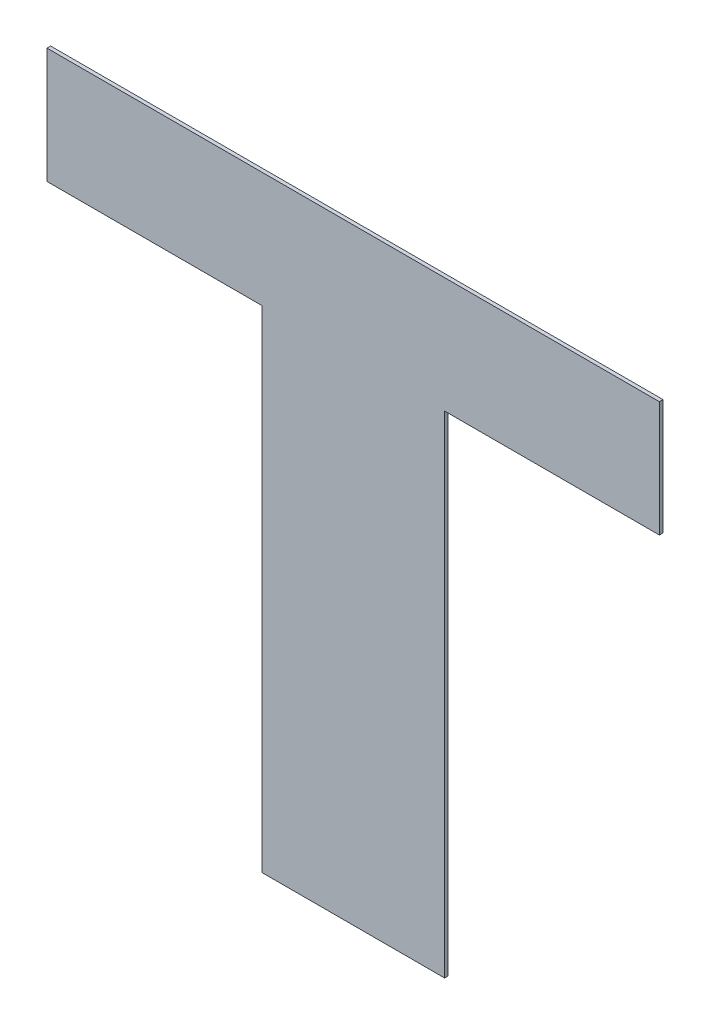
ISO-10303-21;
HEADER;
FILE_DESCRIPTION(('STEP AP214'),'2;1');
FILE_NAME('part.step','',(''),(''),'','','');
FILE_SCHEMA(('AUTOMOTIVE_DESIGN { 1 0 10303 214 1 1 1 1 }'));
ENDSEC;
DATA;
#1=APPLICATION_CONTEXT('core data for automotive mechanical design processes');
#2=APPLICATION_PROTOCOL_DEFINITION('international standard','automotive_design',2000,#1);
#3=PRODUCT_CONTEXT('',#1,'mechanical');
#4=PRODUCT('Part','Part','',(#3));
#5=PRODUCT_RELATED_PRODUCT_CATEGORY('part','',(#4));
#6=PRODUCT_DEFINITION_FORMATION('','',#4);
#7=PRODUCT_DEFINITION_CONTEXT('part definition',#1,'design');
#8=PRODUCT_DEFINITION('design','',#6,#7);
#9=PRODUCT_DEFINITION_SHAPE('','',#8);
#10=(LENGTH_UNIT() NAMED_UNIT(*) SI_UNIT(.MILLI.,.METRE.));
#11=(NAMED_UNIT(*) PLANE_ANGLE_UNIT() SI_UNIT($,.RADIAN.));
#12=(NAMED_UNIT(*) SI_UNIT($,.STERADIAN.) SOLID_ANGLE_UNIT());
#13=UNCERTAINTY_MEASURE_WITH_UNIT(LENGTH_MEASURE(1.E-05),#10,'distance_accuracy_value','');
#14=(GEOMETRIC_REPRESENTATION_CONTEXT(3) GLOBAL_UNCERTAINTY_ASSIGNED_CONTEXT((#13)) GLOBAL_UNIT_ASSIGNED_CONTEXT((#10,
#11,#12)) REPRESENTATION_CONTEXT('',''));
#15=CARTESIAN_POINT('',(0.,0.,0.));
#16=DIRECTION('',(0.,0.,1.));
#17=DIRECTION('',(1.,0.,0.));
#18=AXIS2_PLACEMENT_3D('',#15,#16,#17);
#19=CARTESIAN_POINT('',(0.717532742101244,-2.162479810064,0.));
#20=DIRECTION('',(-1.,0.,0.));
#21=DIRECTION('',(0.,-1.,0.));
#22=AXIS2_PLACEMENT_3D('',#19,#20,#21);
#23=PLANE('',#22);
#24=DIRECTION('',(0.,-1.,0.));
#25=VECTOR('',#24,1.);
#26=CARTESIAN_POINT('',(0.717532742101244,-2.162479810064,0.));
#27=LINE('',#26,#25);
#28=CARTESIAN_POINT('',(0.717532742101244,-2.162479810064,0.));
#29=VERTEX_POINT('',#28);
#30=CARTESIAN_POINT('',(0.717532742101244,-2.257617358337,0.));
#31=VERTEX_POINT('',#30);
#32=EDGE_CURVE('E11',#29,#31,#27,.T.);
#33=ORIENTED_EDGE('',*,*,#32,.T.);
#34=DIRECTION('',(0.,0.,1.));
#35=VECTOR('',#34,1.);
#36=CARTESIAN_POINT('',(0.717532742101244,-2.257617358337,0.));
#37=LINE('',#36,#35);
#38=CARTESIAN_POINT('',(0.717532742101244,-2.257617358337,0.003));
#39=VERTEX_POINT('',#38);
#40=EDGE_CURVE('E24',#31,#39,#37,.T.);
#41=ORIENTED_EDGE('',*,*,#40,.T.);
#42=DIRECTION('',(0.,-1.,0.));
#43=VECTOR('',#42,1.);
#44=CARTESIAN_POINT('',(0.717532742101244,-2.162479810064,0.003));
#45=LINE('',#44,#43);
#46=CARTESIAN_POINT('',(0.717532742101244,-2.162479810064,0.003));
#47=VERTEX_POINT('',#46);
#48=EDGE_CURVE('E100',#47,#39,#45,.T.);
#49=ORIENTED_EDGE('',*,*,#48,.F.);
#50=DIRECTION('',(0.,0.,1.));
#51=VECTOR('',#50,1.);
#52=CARTESIAN_POINT('',(0.717532742101244,-2.162479810064,0.));
#53=LINE('',#52,#51);
#54=EDGE_CURVE('E146',#29,#47,#53,.T.);
#55=ORIENTED_EDGE('',*,*,#54,.F.);
#56=EDGE_LOOP('',(#33,#41,#49,#55));
#57=FACE_BOUND('',#56,.T.);
#58=ADVANCED_FACE('F17',(#57),#23,.T.);
#59=CARTESIAN_POINT('',(1.221964168261,-2.162479810064,0.));
#60=DIRECTION('',(0.,1.,0.));
#61=DIRECTION('',(-1.,0.,0.));
#62=AXIS2_PLACEMENT_3D('',#59,#60,#61);
#63=PLANE('',#62);
#64=DIRECTION('',(-1.,0.,0.));
#65=VECTOR('',#64,1.);
#66=CARTESIAN_POINT('',(1.221964168261,-2.162479810064,0.));
#67=LINE('',#66,#65);
#68=CARTESIAN_POINT('',(1.221964168261,-2.162479810064,0.));
#69=VERTEX_POINT('',#68);
#70=EDGE_CURVE('E143',#69,#29,#67,.T.);
#71=ORIENTED_EDGE('',*,*,#70,.T.);
#72=ORIENTED_EDGE('',*,*,#54,.T.);
#73=DIRECTION('',(-1.,0.,0.));
#74=VECTOR('',#73,1.);
#75=CARTESIAN_POINT('',(1.221964168261,-2.162479810064,0.003));
#76=LINE('',#75,#74);
#77=CARTESIAN_POINT('',(1.221964168261,-2.162479810064,0.003));
#78=VERTEX_POINT('',#77);
#79=EDGE_CURVE('E141',#78,#47,#76,.T.);
#80=ORIENTED_EDGE('',*,*,#79,.F.);
#81=DIRECTION('',(0.,0.,1.));
#82=VECTOR('',#81,1.);
#83=CARTESIAN_POINT('',(1.221964168261,-2.162479810064,0.));
#84=LINE('',#83,#82);
#85=EDGE_CURVE('E138',#69,#78,#84,.T.);
#86=ORIENTED_EDGE('',*,*,#85,.F.);
#87=EDGE_LOOP('',(#71,#72,#80,#86));
#88=FACE_BOUND('',#87,.T.);
#89=ADVANCED_FACE('F163',(#88),#63,.T.);
#90=CARTESIAN_POINT('',(1.221964168261,-2.257617358337,0.));
#91=DIRECTION('',(1.,0.,0.));
#92=DIRECTION('',(0.,1.,0.));
#93=AXIS2_PLACEMENT_3D('',#90,#91,#92);
#94=PLANE('',#93);
#95=DIRECTION('',(0.,1.,0.));
#96=VECTOR('',#95,1.);
#97=CARTESIAN_POINT('',(1.221964168261,-2.257617358337,0.));
#98=LINE('',#97,#96);
#99=CARTESIAN_POINT('',(1.221964168261,-2.257617358337,0.));
#100=VERTEX_POINT('',#99);
#101=EDGE_CURVE('E135',#100,#69,#98,.T.);
#102=ORIENTED_EDGE('',*,*,#101,.T.);
#103=ORIENTED_EDGE('',*,*,#85,.T.);
#104=DIRECTION('',(0.,1.,0.));
#105=VECTOR('',#104,1.);
#106=CARTESIAN_POINT('',(1.221964168261,-2.257617358337,0.003));
#107=LINE('',#106,#105);
#108=CARTESIAN_POINT('',(1.221964168261,-2.257617358337,0.003));
#109=VERTEX_POINT('',#108);
#110=EDGE_CURVE('E132',#109,#78,#107,.T.);
#111=ORIENTED_EDGE('',*,*,#110,.F.);
#112=DIRECTION('',(0.,0.,1.));
#113=VECTOR('',#112,1.);
#114=CARTESIAN_POINT('',(1.221964168261,-2.257617358337,0.));
#115=LINE('',#114,#113);
#116=EDGE_CURVE('E129',#100,#109,#115,.T.);
#117=ORIENTED_EDGE('',*,*,#116,.F.);
#118=EDGE_LOOP('',(#102,#103,#111,#117));
#119=FACE_BOUND('',#118,.T.);
#120=ADVANCED_FACE('F160',(#119),#94,.T.);
#121=CARTESIAN_POINT('',(1.045048812537,-2.257617358337,0.));
#122=DIRECTION('',(0.,-1.,0.));
#123=DIRECTION('',(1.,0.,0.));
#124=AXIS2_PLACEMENT_3D('',#121,#122,#123);
#125=PLANE('',#124);
#126=DIRECTION('',(1.,0.,0.));
#127=VECTOR('',#126,1.);
#128=CARTESIAN_POINT('',(1.045048812537,-2.257617358337,0.));
#129=LINE('',#128,#127);
#130=CARTESIAN_POINT('',(1.045048812537,-2.257617358337,0.));
#131=VERTEX_POINT('',#130);
#132=EDGE_CURVE('E126',#131,#100,#129,.T.);
#133=ORIENTED_EDGE('',*,*,#132,.T.);
#134=ORIENTED_EDGE('',*,*,#116,.T.);
#135=DIRECTION('',(1.,0.,0.));
#136=VECTOR('',#135,1.);
#137=CARTESIAN_POINT('',(1.045048812537,-2.257617358337,0.003));
#138=LINE('',#137,#136);
#139=CARTESIAN_POINT('',(1.045048812537,-2.257617358337,0.003));
#140=VERTEX_POINT('',#139);
#141=EDGE_CURVE('E123',#140,#109,#138,.T.);
#142=ORIENTED_EDGE('',*,*,#141,.F.);
#143=DIRECTION('',(0.,0.,1.));
#144=VECTOR('',#143,1.);
#145=CARTESIAN_POINT('',(1.045048812537,-2.257617358337,0.));
#146=LINE('',#145,#144);
#147=EDGE_CURVE('E120',#131,#140,#146,.T.);
#148=ORIENTED_EDGE('',*,*,#147,.F.);
#149=EDGE_LOOP('',(#133,#134,#142,#148));
#150=FACE_BOUND('',#149,.T.);
#151=ADVANCED_FACE('F157',(#150),#125,.T.);
#152=CARTESIAN_POINT('',(1.045048812537,-2.662053148652,0.));
#153=DIRECTION('',(1.,0.,0.));
#154=DIRECTION('',(0.,1.,0.));
#155=AXIS2_PLACEMENT_3D('',#152,#153,#154);
#156=PLANE('',#155);
#157=DIRECTION('',(0.,1.,0.));
#158=VECTOR('',#157,1.);
#159=CARTESIAN_POINT('',(1.045048812537,-2.662053148652,0.));
#160=LINE('',#159,#158);
#161=CARTESIAN_POINT('',(1.045048812537,-2.662053148652,0.));
#162=VERTEX_POINT('',#161);
#163=EDGE_CURVE('E117',#162,#131,#160,.T.);
#164=ORIENTED_EDGE('',*,*,#163,.T.);
#165=ORIENTED_EDGE('',*,*,#147,.T.);
#166=DIRECTION('',(0.,1.,0.));
#167=VECTOR('',#166,1.);
#168=CARTESIAN_POINT('',(1.045048812537,-2.662053148652,0.003));
#169=LINE('',#168,#167);
#170=CARTESIAN_POINT('',(1.045048812537,-2.662053148652,0.003));
#171=VERTEX_POINT('',#170);
#172=EDGE_CURVE('E114',#171,#140,#169,.T.);
#173=ORIENTED_EDGE('',*,*,#172,.F.);
#174=DIRECTION('',(0.,0.,1.));
#175=VECTOR('',#174,1.);
#176=CARTESIAN_POINT('',(1.045048812537,-2.662053148652,0.));
#177=LINE('',#176,#175);
#178=EDGE_CURVE('E111',#162,#171,#177,.T.);
#179=ORIENTED_EDGE('',*,*,#178,.F.);
#180=EDGE_LOOP('',(#164,#165,#173,#179));
#181=FACE_BOUND('',#180,.T.);
#182=ADVANCED_FACE('F154',(#181),#156,.T.);
#183=CARTESIAN_POINT('',(0.894448097824901,-2.662053148652,0.));
#184=DIRECTION('',(0.,-1.,0.));
#185=DIRECTION('',(1.,0.,0.));
#186=AXIS2_PLACEMENT_3D('',#183,#184,#185);
#187=PLANE('',#186);
#188=DIRECTION('',(1.,0.,0.));
#189=VECTOR('',#188,1.);
#190=CARTESIAN_POINT('',(0.894448097824901,-2.662053148652,0.));
#191=LINE('',#190,#189);
#192=CARTESIAN_POINT('',(0.894448097824901,-2.662053148652,0.));
#193=VERTEX_POINT('',#192);
#194=EDGE_CURVE('E108',#193,#162,#191,.T.);
#195=ORIENTED_EDGE('',*,*,#194,.T.);
#196=ORIENTED_EDGE('',*,*,#178,.T.);
#197=DIRECTION('',(1.,0.,0.));
#198=VECTOR('',#197,1.);
#199=CARTESIAN_POINT('',(0.894448097824901,-2.662053148652,0.003));
#200=LINE('',#199,#198);
#201=CARTESIAN_POINT('',(0.894448097824901,-2.662053148652,0.003));
#202=VERTEX_POINT('',#201);
#203=EDGE_CURVE('E106',#202,#171,#200,.T.);
#204=ORIENTED_EDGE('',*,*,#203,.F.);
#205=DIRECTION('',(0.,0.,1.));
#206=VECTOR('',#205,1.);
#207=CARTESIAN_POINT('',(0.894448097824901,-2.662053148652,0.));
#208=LINE('',#207,#206);
#209=EDGE_CURVE('E85',#193,#202,#208,.T.);
#210=ORIENTED_EDGE('',*,*,#209,.F.);
#211=EDGE_LOOP('',(#195,#196,#204,#210));
#212=FACE_BOUND('',#211,.T.);
#213=ADVANCED_FACE('F152',(#212),#187,.T.);
#214=CARTESIAN_POINT('',(0.894448097824901,-2.257617358337,0.));
#215=DIRECTION('',(-1.,0.,0.));
#216=DIRECTION('',(0.,-1.,0.));
#217=AXIS2_PLACEMENT_3D('',#214,#215,#216);
#218=PLANE('',#217);
#219=DIRECTION('',(0.,-1.,0.));
#220=VECTOR('',#219,1.);
#221=CARTESIAN_POINT('',(0.894448097824901,-2.257617358337,0.));
#222=LINE('',#221,#220);
#223=CARTESIAN_POINT('',(0.894448097824901,-2.257617358337,0.));
#224=VERTEX_POINT('',#223);
#225=EDGE_CURVE('E89',#224,#193,#222,.T.);
#226=ORIENTED_EDGE('',*,*,#225,.T.);
#227=ORIENTED_EDGE('',*,*,#209,.T.);
#228=DIRECTION('',(0.,-1.,0.));
#229=VECTOR('',#228,1.);
#230=CARTESIAN_POINT('',(0.894448097824901,-2.257617358337,0.003));
#231=LINE('',#230,#229);
#232=CARTESIAN_POINT('',(0.894448097824901,-2.257617358337,0.003));
#233=VERTEX_POINT('',#232);
#234=EDGE_CURVE('E78',#233,#202,#231,.T.);
#235=ORIENTED_EDGE('',*,*,#234,.F.);
#236=DIRECTION('',(0.,0.,1.));
#237=VECTOR('',#236,1.);
#238=CARTESIAN_POINT('',(0.894448097824901,-2.257617358337,0.));
#239=LINE('',#238,#237);
#240=EDGE_CURVE('E82',#224,#233,#239,.T.);
#241=ORIENTED_EDGE('',*,*,#240,.F.);
#242=EDGE_LOOP('',(#226,#227,#235,#241));
#243=FACE_BOUND('',#242,.T.);
#244=ADVANCED_FACE('F81',(#243),#218,.T.);
#245=CARTESIAN_POINT('',(0.717532742101244,-2.257617358337,0.));
#246=DIRECTION('',(0.,-1.,0.));
#247=DIRECTION('',(1.,0.,0.));
#248=AXIS2_PLACEMENT_3D('',#245,#246,#247);
#249=PLANE('',#248);
#250=DIRECTION('',(1.,0.,0.));
#251=VECTOR('',#250,1.);
#252=CARTESIAN_POINT('',(0.717532742101244,-2.257617358337,0.));
#253=LINE('',#252,#251);
#254=EDGE_CURVE('E95',#31,#224,#253,.T.);
#255=ORIENTED_EDGE('',*,*,#254,.T.);
#256=ORIENTED_EDGE('',*,*,#240,.T.);
#257=DIRECTION('',(1.,0.,0.));
#258=VECTOR('',#257,1.);
#259=CARTESIAN_POINT('',(0.717532742101244,-2.257617358337,0.003));
#260=LINE('',#259,#258);
#261=EDGE_CURVE('E94',#39,#233,#260,.T.);
#262=ORIENTED_EDGE('',*,*,#261,.F.);
#263=ORIENTED_EDGE('',*,*,#40,.F.);
#264=EDGE_LOOP('',(#255,#256,#262,#263));
#265=FACE_BOUND('',#264,.T.);
#266=ADVANCED_FACE('F93',(#265),#249,.T.);
#267=CARTESIAN_POINT('',(0.969748455180964,-2.412266479358,0.003));
#268=DIRECTION('',(0.,0.,1.));
#269=DIRECTION('',(1.,0.,0.));
#270=AXIS2_PLACEMENT_3D('',#267,#268,#269);
#271=PLANE('',#270);
#272=ORIENTED_EDGE('',*,*,#261,.T.);
#273=ORIENTED_EDGE('',*,*,#234,.T.);
#274=ORIENTED_EDGE('',*,*,#203,.T.);
#275=ORIENTED_EDGE('',*,*,#172,.T.);
#276=ORIENTED_EDGE('',*,*,#141,.T.);
#277=ORIENTED_EDGE('',*,*,#110,.T.);
#278=ORIENTED_EDGE('',*,*,#79,.T.);
#279=ORIENTED_EDGE('',*,*,#48,.T.);
#280=EDGE_LOOP('',(#272,#273,#274,#275,#276,#277,#278,#279));
#281=FACE_BOUND('',#280,.T.);
#282=ADVANCED_FACE('F98',(#281),#271,.T.);
#283=CARTESIAN_POINT('',(0.969748455180964,-2.412266479358,0.));
#284=DIRECTION('',(0.,0.,1.));
#285=DIRECTION('',(1.,0.,0.));
#286=AXIS2_PLACEMENT_3D('',#283,#284,#285);
#287=PLANE('',#286);
#288=ORIENTED_EDGE('',*,*,#254,.F.);
#289=ORIENTED_EDGE('',*,*,#32,.F.);
#290=ORIENTED_EDGE('',*,*,#70,.F.);
#291=ORIENTED_EDGE('',*,*,#101,.F.);
#292=ORIENTED_EDGE('',*,*,#132,.F.);
#293=ORIENTED_EDGE('',*,*,#163,.F.);
#294=ORIENTED_EDGE('',*,*,#194,.F.);
#295=ORIENTED_EDGE('',*,*,#225,.F.);
#296=EDGE_LOOP('',(#288,#289,#290,#291,#292,#293,#294,#295));
#297=FACE_BOUND('',#296,.T.);
#298=ADVANCED_FACE('F149',(#297),#287,.F.);
#299=CLOSED_SHELL('',(#58,#89,#120,#151,#182,#213,#244,#266,#282,#298));
#300=MANIFOLD_SOLID_BREP('B1',#299);
#301=ADVANCED_BREP_SHAPE_REPRESENTATION('',(#18,#300),#14);
#302=SHAPE_DEFINITION_REPRESENTATION(#9,#301);
ENDSEC;
END-ISO-10303-21;
